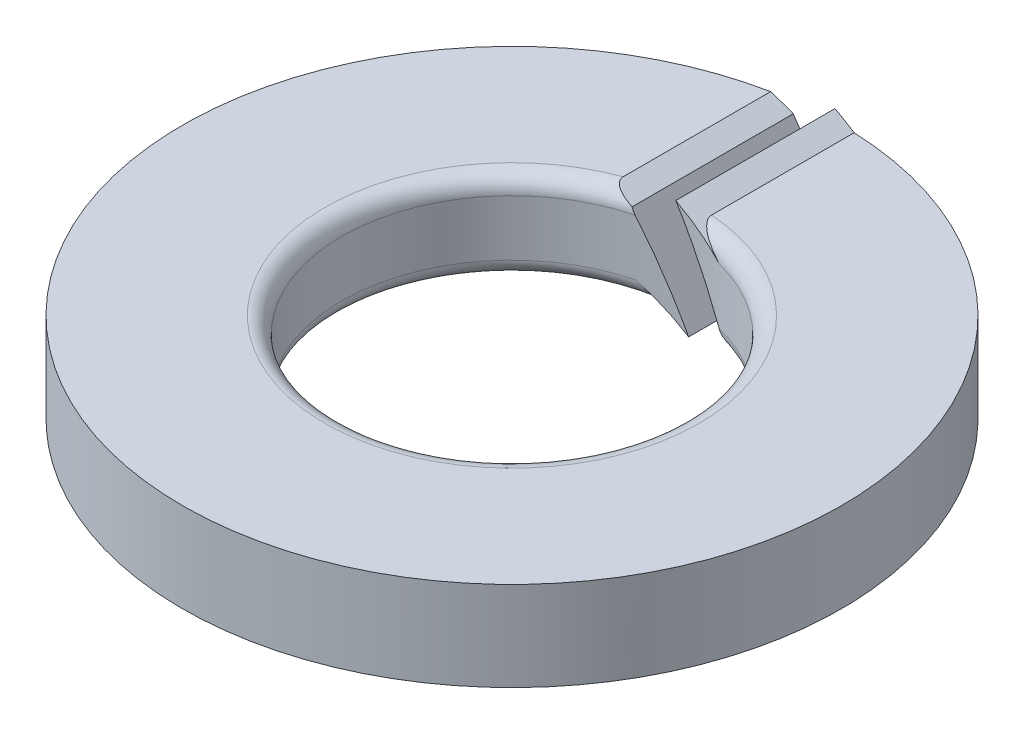
ISO-10303-21;
HEADER;
FILE_DESCRIPTION(('STEP AP214'),'2;1');
FILE_NAME('part.step','',(''),(''),'','','');
FILE_SCHEMA(('AUTOMOTIVE_DESIGN { 1 0 10303 214 1 1 1 1 }'));
ENDSEC;
DATA;
#1=APPLICATION_CONTEXT('core data for automotive mechanical design processes');
#2=APPLICATION_PROTOCOL_DEFINITION('international standard','automotive_design',2000,#1);
#3=PRODUCT_CONTEXT('',#1,'mechanical');
#4=PRODUCT('Part','Part','',(#3));
#5=PRODUCT_RELATED_PRODUCT_CATEGORY('part','',(#4));
#6=PRODUCT_DEFINITION_FORMATION('','',#4);
#7=PRODUCT_DEFINITION_CONTEXT('part definition',#1,'design');
#8=PRODUCT_DEFINITION('design','',#6,#7);
#9=PRODUCT_DEFINITION_SHAPE('','',#8);
#10=(LENGTH_UNIT() NAMED_UNIT(*) SI_UNIT(.MILLI.,.METRE.));
#11=(NAMED_UNIT(*) PLANE_ANGLE_UNIT() SI_UNIT($,.RADIAN.));
#12=(NAMED_UNIT(*) SI_UNIT($,.STERADIAN.) SOLID_ANGLE_UNIT());
#13=UNCERTAINTY_MEASURE_WITH_UNIT(LENGTH_MEASURE(1.E-05),#10,'distance_accuracy_value','');
#14=(GEOMETRIC_REPRESENTATION_CONTEXT(3) GLOBAL_UNCERTAINTY_ASSIGNED_CONTEXT((#13)) GLOBAL_UNIT_ASSIGNED_CONTEXT((#10,
#11,#12)) REPRESENTATION_CONTEXT('',''));
#15=CARTESIAN_POINT('',(0.,0.,0.));
#16=DIRECTION('',(0.,0.,1.));
#17=DIRECTION('',(1.,0.,0.));
#18=AXIS2_PLACEMENT_3D('',#15,#16,#17);
#19=CARTESIAN_POINT('',(0.,0.,0.));
#20=DIRECTION('',(0.,-1.,0.));
#21=DIRECTION('',(0.,0.,-1.));
#22=AXIS2_PLACEMENT_3D('',#19,#20,#21);
#23=CYLINDRICAL_SURFACE('',#22,5.9);
#24=CARTESIAN_POINT('',(0.,0.933333333333333,0.));
#25=DIRECTION('',(-0.499999999999998,-0.86602540378444,0.));
#26=DIRECTION('',(0.86602540378444,-0.499999999999998,0.));
#27=AXIS2_PLACEMENT_3D('',#24,#25,#26);
#28=ELLIPSE('',#27,6.81273317643758,5.9);
#29=CARTESIAN_POINT('',(0.230940107675852,0.799999999999999,-5.8954784934445));
#30=VERTEX_POINT('',#29);
#31=CARTESIAN_POINT('',(-0.115470053837926,0.999999999999999,-5.8988699482754));
#32=VERTEX_POINT('',#31);
#33=EDGE_CURVE('E124',#30,#32,#28,.F.);
#34=ORIENTED_EDGE('',*,*,#33,.F.);
#35=CARTESIAN_POINT('',(0.,0.799999999999999,0.));
#36=DIRECTION('',(0.,1.,0.));
#37=DIRECTION('',(-1.,0.,0.));
#38=AXIS2_PLACEMENT_3D('',#35,#36,#37);
#39=CIRCLE('',#38,5.9);
#40=CARTESIAN_POINT('',(-1.15470053837926,0.799999999999999,-5.78590240728848));
#41=VERTEX_POINT('',#40);
#42=EDGE_CURVE('E114',#30,#41,#39,.F.);
#43=ORIENTED_EDGE('',*,*,#42,.T.);
#44=CARTESIAN_POINT('',(0.,0.133333333333335,0.));
#45=DIRECTION('',(-0.499999999999997,-0.86602540378444,0.));
#46=DIRECTION('',(0.86602540378444,-0.499999999999997,0.));
#47=AXIS2_PLACEMENT_3D('',#44,#45,#46);
#48=ELLIPSE('',#47,6.81273317643757,5.9);
#49=CARTESIAN_POINT('',(-0.808290376865477,0.599999999999999,-5.84437051072797));
#50=VERTEX_POINT('',#49);
#51=EDGE_CURVE('E131',#50,#41,#48,.F.);
#52=ORIENTED_EDGE('',*,*,#51,.F.);
#53=CARTESIAN_POINT('',(0.,-0.799999999999997,0.));
#54=DIRECTION('',(-0.866025403784438,-0.500000000000001,0.));
#55=DIRECTION('',(0.500000000000001,-0.866025403784438,0.));
#56=AXIS2_PLACEMENT_3D('',#53,#54,#55);
#57=ELLIPSE('',#56,11.8,5.9);
#58=CARTESIAN_POINT('',(0.115470053837927,-1.,-5.8988699482754));
#59=VERTEX_POINT('',#58);
#60=EDGE_CURVE('E246',#59,#50,#57,.F.);
#61=ORIENTED_EDGE('',*,*,#60,.F.);
#62=CARTESIAN_POINT('',(0.,-0.933333333333333,0.));
#63=DIRECTION('',(0.499999999999997,0.866025403784441,0.));
#64=DIRECTION('',(0.866025403784441,-0.499999999999997,0.));
#65=AXIS2_PLACEMENT_3D('',#62,#63,#64);
#66=ELLIPSE('',#65,6.81273317643757,5.9);
#67=CARTESIAN_POINT('',(-0.23094010767585,-0.800000000000001,-5.8954784934445));
#68=VERTEX_POINT('',#67);
#69=EDGE_CURVE('E248',#68,#59,#66,.F.);
#70=ORIENTED_EDGE('',*,*,#69,.F.);
#71=CARTESIAN_POINT('',(0.,-0.800000000000001,0.));
#72=DIRECTION('',(0.,-1.,0.));
#73=DIRECTION('',(1.,0.,0.));
#74=AXIS2_PLACEMENT_3D('',#71,#72,#73);
#75=CIRCLE('',#74,5.9);
#76=CARTESIAN_POINT('',(1.15470053837926,-0.8,-5.78590240728848));
#77=VERTEX_POINT('',#76);
#78=EDGE_CURVE('E123',#68,#77,#75,.F.);
#79=ORIENTED_EDGE('',*,*,#78,.T.);
#80=CARTESIAN_POINT('',(0.,-0.133333333333333,0.));
#81=DIRECTION('',(0.499999999999999,0.866025403784439,0.));
#82=DIRECTION('',(0.866025403784439,-0.499999999999999,0.));
#83=AXIS2_PLACEMENT_3D('',#80,#81,#82);
#84=ELLIPSE('',#83,6.81273317643758,5.9);
#85=CARTESIAN_POINT('',(0.808290376865478,-0.6,-5.84437051072797));
#86=VERTEX_POINT('',#85);
#87=EDGE_CURVE('E138',#86,#77,#84,.F.);
#88=ORIENTED_EDGE('',*,*,#87,.F.);
#89=CARTESIAN_POINT('',(0.,0.799999999999999,0.));
#90=DIRECTION('',(0.866025403784438,0.500000000000001,0.));
#91=DIRECTION('',(0.500000000000001,-0.866025403784438,0.));
#92=AXIS2_PLACEMENT_3D('',#89,#90,#91);
#93=ELLIPSE('',#92,11.8,5.9);
#94=EDGE_CURVE('E136',#32,#86,#93,.F.);
#95=ORIENTED_EDGE('',*,*,#94,.F.);
#96=EDGE_LOOP('',(#34,#43,#52,#61,#70,#79,#88,#95));
#97=FACE_BOUND('',#96,.T.);
#98=ADVANCED_FACE('F33',(#97),#23,.T.);
#99=CARTESIAN_POINT('',(0.,0.,0.));
#100=DIRECTION('',(0.,-1.,0.));
#101=DIRECTION('',(0.,0.,-1.));
#102=AXIS2_PLACEMENT_3D('',#99,#100,#101);
#103=CYLINDRICAL_SURFACE('',#102,3.05);
#104=CARTESIAN_POINT('',(0.,0.799999999999999,0.));
#105=DIRECTION('',(0.866025403784438,0.500000000000001,0.));
#106=DIRECTION('',(0.500000000000001,-0.866025403784438,0.));
#107=AXIS2_PLACEMENT_3D('',#104,#105,#106);
#108=ELLIPSE('',#107,6.09999999999998,3.05);
#109=CARTESIAN_POINT('',(0.750555349946516,-0.500000000000001,-2.9562081568568));
#110=VERTEX_POINT('',#109);
#111=CARTESIAN_POINT('',(-0.115470053837926,0.999999999999999,-3.04781342386089));
#112=VERTEX_POINT('',#111);
#113=EDGE_CURVE('E147',#110,#112,#108,.T.);
#114=ORIENTED_EDGE('',*,*,#113,.F.);
#115=CARTESIAN_POINT('',(0.,-0.500000000000001,0.));
#116=DIRECTION('',(0.,-1.,0.));
#117=DIRECTION('',(1.,0.,0.));
#118=AXIS2_PLACEMENT_3D('',#115,#116,#117);
#119=CIRCLE('',#118,3.05);
#120=CARTESIAN_POINT('',(-0.750555349946519,-0.500000000000001,-2.9562081568568));
#121=VERTEX_POINT('',#120);
#122=EDGE_CURVE('E154',#110,#121,#119,.T.);
#123=ORIENTED_EDGE('',*,*,#122,.T.);
#124=CARTESIAN_POINT('',(0.,-0.933333333333333,0.));
#125=DIRECTION('',(0.499999999999997,0.866025403784441,0.));
#126=DIRECTION('',(0.866025403784441,-0.499999999999997,0.));
#127=AXIS2_PLACEMENT_3D('',#124,#125,#126);
#128=ELLIPSE('',#127,3.52183664205671,3.05);
#129=CARTESIAN_POINT('',(0.115470053837927,-1.,-3.04781342386089));
#130=VERTEX_POINT('',#129);
#131=EDGE_CURVE('E145',#130,#121,#128,.T.);
#132=ORIENTED_EDGE('',*,*,#131,.F.);
#133=CARTESIAN_POINT('',(0.,-0.799999999999997,0.));
#134=DIRECTION('',(-0.866025403784438,-0.500000000000001,0.));
#135=DIRECTION('',(0.500000000000001,-0.866025403784438,0.));
#136=AXIS2_PLACEMENT_3D('',#133,#134,#135);
#137=ELLIPSE('',#136,6.09999999999998,3.05);
#138=CARTESIAN_POINT('',(-0.750555349946514,0.499999999999999,-2.9562081568568));
#139=VERTEX_POINT('',#138);
#140=EDGE_CURVE('E143',#139,#130,#137,.T.);
#141=ORIENTED_EDGE('',*,*,#140,.F.);
#142=CARTESIAN_POINT('',(0.,0.499999999999999,0.));
#143=DIRECTION('',(0.,1.,0.));
#144=DIRECTION('',(-1.,0.,0.));
#145=AXIS2_PLACEMENT_3D('',#142,#143,#144);
#146=CIRCLE('',#145,3.05);
#147=CARTESIAN_POINT('',(0.750555349946516,0.5,-2.9562081568568));
#148=VERTEX_POINT('',#147);
#149=EDGE_CURVE('E151',#139,#148,#146,.T.);
#150=ORIENTED_EDGE('',*,*,#149,.T.);
#151=CARTESIAN_POINT('',(0.,0.933333333333333,0.));
#152=DIRECTION('',(-0.499999999999998,-0.86602540378444,0.));
#153=DIRECTION('',(0.86602540378444,-0.499999999999998,0.));
#154=AXIS2_PLACEMENT_3D('',#151,#152,#153);
#155=ELLIPSE('',#154,3.52183664205671,3.05);
#156=EDGE_CURVE('E149',#112,#148,#155,.T.);
#157=ORIENTED_EDGE('',*,*,#156,.F.);
#158=EDGE_LOOP('',(#114,#123,#132,#141,#150,#157));
#159=FACE_BOUND('',#158,.T.);
#160=ADVANCED_FACE('F210',(#159),#103,.F.);
#161=CARTESIAN_POINT('',(5.9,-0.8,5.9));
#162=DIRECTION('',(0.,-1.,0.));
#163=DIRECTION('',(1.,0.,0.));
#164=AXIS2_PLACEMENT_3D('',#161,#162,#163);
#165=PLANE('',#164);
#166=DIRECTION('',(0.,0.,1.));
#167=VECTOR('',#166,1.);
#168=CARTESIAN_POINT('',(-0.23094010767585,-0.800000000000001,-5.9));
#169=LINE('',#168,#167);
#170=CARTESIAN_POINT('',(-0.23094010767585,-0.800000000000001,-3.34203032102742));
#171=VERTEX_POINT('',#170);
#172=EDGE_CURVE('E229',#68,#171,#169,.T.);
#173=ORIENTED_EDGE('',*,*,#172,.T.);
#174=CARTESIAN_POINT('',(0.,-0.800000000000001,0.));
#175=DIRECTION('',(0.,-1.,0.));
#176=DIRECTION('',(1.,0.,0.));
#177=AXIS2_PLACEMENT_3D('',#174,#175,#176);
#178=CIRCLE('',#177,3.35);
#179=CARTESIAN_POINT('',(1.15470053837926,-0.8,-3.14470454362038));
#180=VERTEX_POINT('',#179);
#181=EDGE_CURVE('E157',#171,#180,#178,.F.);
#182=ORIENTED_EDGE('',*,*,#181,.T.);
#183=DIRECTION('',(0.,0.,1.));
#184=VECTOR('',#183,1.);
#185=CARTESIAN_POINT('',(1.15470053837926,-0.8,-5.9));
#186=LINE('',#185,#184);
#187=EDGE_CURVE('E234',#77,#180,#186,.T.);
#188=ORIENTED_EDGE('',*,*,#187,.F.);
#189=ORIENTED_EDGE('',*,*,#78,.F.);
#190=EDGE_LOOP('',(#173,#182,#188,#189));
#191=FACE_BOUND('',#190,.T.);
#192=ADVANCED_FACE('F207',(#191),#165,.T.);
#193=CARTESIAN_POINT('',(5.9,0.8,5.9));
#194=DIRECTION('',(0.,1.,0.));
#195=DIRECTION('',(-1.,0.,0.));
#196=AXIS2_PLACEMENT_3D('',#193,#194,#195);
#197=PLANE('',#196);
#198=DIRECTION('',(0.,0.,1.));
#199=VECTOR('',#198,1.);
#200=CARTESIAN_POINT('',(0.230940107675852,0.799999999999999,-5.9));
#201=LINE('',#200,#199);
#202=CARTESIAN_POINT('',(0.230940107675852,0.799999999999999,-3.34203032102742));
#203=VERTEX_POINT('',#202);
#204=EDGE_CURVE('E117',#30,#203,#201,.T.);
#205=ORIENTED_EDGE('',*,*,#204,.T.);
#206=CARTESIAN_POINT('',(0.,0.799999999999999,0.));
#207=DIRECTION('',(0.,1.,0.));
#208=DIRECTION('',(-1.,0.,0.));
#209=AXIS2_PLACEMENT_3D('',#206,#207,#208);
#210=CIRCLE('',#209,3.35);
#211=CARTESIAN_POINT('',(-1.15470053837926,0.799999999999999,-3.14470454362038));
#212=VERTEX_POINT('',#211);
#213=EDGE_CURVE('E61',#203,#212,#210,.F.);
#214=ORIENTED_EDGE('',*,*,#213,.T.);
#215=DIRECTION('',(0.,0.,1.));
#216=VECTOR('',#215,1.);
#217=CARTESIAN_POINT('',(-1.15470053837926,0.799999999999999,-5.9));
#218=LINE('',#217,#216);
#219=EDGE_CURVE('E118',#41,#212,#218,.T.);
#220=ORIENTED_EDGE('',*,*,#219,.F.);
#221=ORIENTED_EDGE('',*,*,#42,.F.);
#222=EDGE_LOOP('',(#205,#214,#220,#221));
#223=FACE_BOUND('',#222,.T.);
#224=ADVANCED_FACE('F116',(#223),#197,.T.);
#225=CARTESIAN_POINT('',(0.808290376865478,-0.6,-5.9));
#226=DIRECTION('',(0.499999999999999,0.866025403784439,0.));
#227=DIRECTION('',(-0.866025403784439,0.499999999999999,0.));
#228=AXIS2_PLACEMENT_3D('',#225,#226,#227);
#229=PLANE('',#228);
#230=ORIENTED_EDGE('',*,*,#187,.T.);
#231=CARTESIAN_POINT('',(1.15470053837926,-0.8,-3.14470454362038));
#232=CARTESIAN_POINT('',(1.15472724232958,-0.800015417532906,-3.13546044768566));
#233=CARTESIAN_POINT('',(1.15405080912969,-0.799624878642861,-3.12618916848948));
#234=CARTESIAN_POINT('',(1.15124977527525,-0.798007700992993,-3.10798319921414));
#235=CARTESIAN_POINT('',(1.14913068868081,-0.796784245777258,-3.09904736374361));
#236=CARTESIAN_POINT('',(1.14338736034663,-0.793468333617474,-3.08177948638672));
#237=CARTESIAN_POINT('',(1.13975477897806,-0.791371061786476,-3.07345109514843));
#238=CARTESIAN_POINT('',(1.13118155395271,-0.786421308010268,-3.05776800553277));
#239=CARTESIAN_POINT('',(1.12624169042694,-0.783569276473904,-3.05041273035423));
#240=CARTESIAN_POINT('',(1.11458972132114,-0.77684200897408,-3.03584116203186));
#241=CARTESIAN_POINT('',(1.10772638727571,-0.772879461215413,-3.02878812854533));
#242=CARTESIAN_POINT('',(1.09311287349914,-0.764442345102705,-3.01603488125443));
#243=CARTESIAN_POINT('',(1.0853605828171,-0.759966557990594,-3.01033799066908));
#244=CARTESIAN_POINT('',(1.06408325926674,-0.747682089511159,-2.99680553816842));
#245=CARTESIAN_POINT('',(1.05008064432668,-0.739597676006154,-2.98998599004732));
#246=CARTESIAN_POINT('',(1.02133000699907,-0.722998487805688,-2.97868603875841));
#247=CARTESIAN_POINT('',(1.00657740979672,-0.714481071839665,-2.9742225351519));
#248=CARTESIAN_POINT('',(0.976395708959408,-0.697055658736642,-2.96696746939307));
#249=CARTESIAN_POINT('',(0.960958906096382,-0.688143216448246,-2.96422027409468));
#250=CARTESIAN_POINT('',(0.929929680272982,-0.670228484566361,-2.96011963502286));
#251=CARTESIAN_POINT('',(0.914337033317726,-0.661226065649365,-2.95876862403869));
#252=CARTESIAN_POINT('',(0.883631158582293,-0.64349802060516,-2.95718792714175));
#253=CARTESIAN_POINT('',(0.868519146027506,-0.634773096088656,-2.95692260454203));
#254=CARTESIAN_POINT('',(0.838360658409041,-0.617361085143784,-2.95724074599216));
#255=CARTESIAN_POINT('',(0.823314161447282,-0.608673986072551,-2.95782084288035));
#256=CARTESIAN_POINT('',(0.808290376865478,-0.6,-2.95873630002518));
#257=B_SPLINE_CURVE_WITH_KNOTS('',3,(#231,#232,#233,#234,#235,#236,#237,#238,#239,#240,#241,
#242,#243,#244,#245,#246,#247,#248,#249,#250,#251,#252,#253,#254,#255,#256),.UNSPECIFIED.,.F.,
.F.,(4,2,2,2,2,2,2,2,2,2,2,2,4),(0.,0.0277371728501738,0.0553689204704561,0.0831549808886673,
0.110924497000333,0.142577180145474,0.174306647406277,0.22665553217314,0.279374973446515,
0.33340624079824,0.387531497305223,0.439865154937414,0.491990945320323),.UNSPECIFIED.);
#258=CARTESIAN_POINT('',(0.808290376865478,-0.6,-2.95873630002518));
#259=VERTEX_POINT('',#258);
#260=EDGE_CURVE('E159',#180,#259,#257,.T.);
#261=ORIENTED_EDGE('',*,*,#260,.T.);
#262=DIRECTION('',(0.,0.,1.));
#263=VECTOR('',#262,1.);
#264=CARTESIAN_POINT('',(0.808290376865478,-0.6,-5.9));
#265=LINE('',#264,#263);
#266=EDGE_CURVE('E237',#86,#259,#265,.T.);
#267=ORIENTED_EDGE('',*,*,#266,.F.);
#268=ORIENTED_EDGE('',*,*,#87,.T.);
#269=EDGE_LOOP('',(#230,#261,#267,#268));
#270=FACE_BOUND('',#269,.T.);
#271=ADVANCED_FACE('F174',(#270),#229,.F.);
#272=CARTESIAN_POINT('',(0.808290376865478,-0.6,-5.9));
#273=DIRECTION('',(0.866025403784438,0.500000000000001,0.));
#274=DIRECTION('',(-0.500000000000001,0.866025403784438,0.));
#275=AXIS2_PLACEMENT_3D('',#272,#273,#274);
#276=PLANE('',#275);
#277=ORIENTED_EDGE('',*,*,#266,.T.);
#278=CARTESIAN_POINT('',(0.808290376865478,-0.6,-2.95873630002518));
#279=CARTESIAN_POINT('',(0.803521321668378,-0.591739754094521,-2.95701186657913));
#280=CARTESIAN_POINT('',(0.798717755783908,-0.583419733925116,-2.95568780189027));
#281=CARTESIAN_POINT('',(0.789100692298362,-0.566762491348535,-2.9538140558413));
#282=CARTESIAN_POINT('',(0.784287411071207,-0.558425643711985,-2.95325996033055));
#283=CARTESIAN_POINT('',(0.774655035105818,-0.541741879142326,-2.95288072339885));
#284=CARTESIAN_POINT('',(0.769835941251392,-0.533394963740017,-2.95305548242653));
#285=CARTESIAN_POINT('',(0.76018879235283,-0.516685611699525,-2.95410727970608));
#286=CARTESIAN_POINT('',(0.755360846938961,-0.508323364946535,-2.95498837769461));
#287=CARTESIAN_POINT('',(0.750555349946516,-0.500000000000001,-2.9562081568568));
#288=B_SPLINE_CURVE_WITH_KNOTS('',3,(#278,#279,#280,#281,#282,#283,#284,#285,#286,#287),
.UNSPECIFIED.,.F.,.F.,(4,2,2,2,4),(0.,0.0290649745563326,0.0579626255247683,0.0868563296059689,
0.115917303418203),.UNSPECIFIED.);
#289=EDGE_CURVE('E165',#259,#110,#288,.T.);
#290=ORIENTED_EDGE('',*,*,#289,.T.);
#291=ORIENTED_EDGE('',*,*,#113,.T.);
#292=DIRECTION('',(0.,0.,1.));
#293=VECTOR('',#292,1.);
#294=CARTESIAN_POINT('',(-0.115470053837926,0.999999999999999,-5.9));
#295=LINE('',#294,#293);
#296=EDGE_CURVE('E132',#32,#112,#295,.T.);
#297=ORIENTED_EDGE('',*,*,#296,.F.);
#298=ORIENTED_EDGE('',*,*,#94,.T.);
#299=EDGE_LOOP('',(#277,#290,#291,#297,#298));
#300=FACE_BOUND('',#299,.T.);
#301=ADVANCED_FACE('F178',(#300),#276,.F.);
#302=CARTESIAN_POINT('',(-0.115470053837926,0.999999999999999,-5.9));
#303=DIRECTION('',(-0.499999999999998,-0.86602540378444,0.));
#304=DIRECTION('',(0.86602540378444,-0.499999999999998,0.));
#305=AXIS2_PLACEMENT_3D('',#302,#303,#304);
#306=PLANE('',#305);
#307=ORIENTED_EDGE('',*,*,#33,.T.);
#308=ORIENTED_EDGE('',*,*,#296,.T.);
#309=ORIENTED_EDGE('',*,*,#156,.T.);
#310=CARTESIAN_POINT('',(0.750555349946517,0.499999999999999,-2.9562081568568));
#311=CARTESIAN_POINT('',(0.725088390240705,0.514703356041591,-2.9626986312174));
#312=CARTESIAN_POINT('',(0.699747762029129,0.529333774560979,-2.9698740448105));
#313=CARTESIAN_POINT('',(0.649350384156601,0.558430714242134,-2.9856871291144));
#314=CARTESIAN_POINT('',(0.624294403474859,0.572896791433548,-2.99432806063932));
#315=CARTESIAN_POINT('',(0.574499200549006,0.601646065247141,-3.01317912084795));
#316=CARTESIAN_POINT('',(0.549761959374783,0.615928118098087,-3.02339626810047));
#317=CARTESIAN_POINT('',(0.500913527173893,0.644130773578762,-3.04561607171586));
#318=CARTESIAN_POINT('',(0.476801724916092,0.658051729102951,-3.05761690126072));
#319=CARTESIAN_POINT('',(0.436445199908578,0.681351579679597,-3.08001369310359));
#320=CARTESIAN_POINT('',(0.419967724083129,0.690864854782985,-3.08984760662272));
#321=CARTESIAN_POINT('',(0.387659463764345,0.709518037575083,-3.11090740545599));
#322=CARTESIAN_POINT('',(0.371829342441877,0.718657562381914,-3.12213467291217));
#323=CARTESIAN_POINT('',(0.341056198944345,0.736424445064026,-3.14643473119891));
#324=CARTESIAN_POINT('',(0.326121902409167,0.745046765188768,-3.15952245725661));
#325=CARTESIAN_POINT('',(0.297959573092921,0.76130629360051,-3.1879920285391));
#326=CARTESIAN_POINT('',(0.284727351245715,0.768945920445971,-3.20336803244634));
#327=CARTESIAN_POINT('',(0.266951180456217,0.779208997436448,-3.22889741547982));
#328=CARTESIAN_POINT('',(0.261290326812129,0.782477292811706,-3.23800373080083));
#329=CARTESIAN_POINT('',(0.251120927595302,0.788348598187037,-3.25699645389906));
#330=CARTESIAN_POINT('',(0.246607128312001,0.790954641418319,-3.26687902328065));
#331=CARTESIAN_POINT('',(0.23913322264627,0.795269702866327,-3.28731403690176));
#332=CARTESIAN_POINT('',(0.236158348782162,0.796987247092575,-3.29785898209644));
#333=CARTESIAN_POINT('',(0.232031693115451,0.799369772852603,-3.31958085455425));
#334=CARTESIAN_POINT('',(0.230910085993167,0.800017333026579,-3.33076523125679));
#335=CARTESIAN_POINT('',(0.230940107675851,0.799999999999999,-3.34203032102742));
#336=B_SPLINE_CURVE_WITH_KNOTS('',3,(#310,#311,#312,#313,#314,#315,#316,#317,#318,#319,#320,
#321,#322,#323,#324,#325,#326,#327,#328,#329,#330,#331,#332,#333,#334,#335),.UNSPECIFIED.,.F.,
.F.,(4,2,2,2,2,2,2,2,2,2,2,2,4),(0.,0.0903429040447332,0.180889525745232,0.27185163500438,
0.362721216271426,0.426932291458256,0.491207577914841,0.55603151414847,0.620692725148271,
0.654240148271217,0.687631030370202,0.720695256154746,0.754292708175523),.UNSPECIFIED.);
#337=EDGE_CURVE('E11',#148,#203,#336,.T.);
#338=ORIENTED_EDGE('',*,*,#337,.T.);
#339=ORIENTED_EDGE('',*,*,#204,.F.);
#340=EDGE_LOOP('',(#307,#308,#309,#338,#339));
#341=FACE_BOUND('',#340,.T.);
#342=ADVANCED_FACE('F127',(#341),#306,.F.);
#343=CARTESIAN_POINT('',(0.115470053837927,-1.,-5.9));
#344=DIRECTION('',(0.499999999999997,0.866025403784441,0.));
#345=DIRECTION('',(-0.866025403784441,0.499999999999997,0.));
#346=AXIS2_PLACEMENT_3D('',#343,#344,#345);
#347=PLANE('',#346);
#348=ORIENTED_EDGE('',*,*,#69,.T.);
#349=DIRECTION('',(0.,0.,1.));
#350=VECTOR('',#349,1.);
#351=CARTESIAN_POINT('',(0.115470053837927,-1.,-5.9));
#352=LINE('',#351,#350);
#353=EDGE_CURVE('E235',#59,#130,#352,.T.);
#354=ORIENTED_EDGE('',*,*,#353,.T.);
#355=ORIENTED_EDGE('',*,*,#131,.T.);
#356=CARTESIAN_POINT('',(-0.750555349946519,-0.500000000000001,-2.9562081568568));
#357=CARTESIAN_POINT('',(-0.725088390240707,-0.514703356041592,-2.9626986312174));
#358=CARTESIAN_POINT('',(-0.699747762029131,-0.52933377456098,-2.9698740448105));
#359=CARTESIAN_POINT('',(-0.649350384156603,-0.558430714242135,-2.9856871291144));
#360=CARTESIAN_POINT('',(-0.624294403474861,-0.572896791433549,-2.99432806063932));
#361=CARTESIAN_POINT('',(-0.574499200549009,-0.601646065247141,-3.01317912084795));
#362=CARTESIAN_POINT('',(-0.549761959374786,-0.615928118098087,-3.02339626810047));
#363=CARTESIAN_POINT('',(-0.500913527173897,-0.644130773578761,-3.04561607171585));
#364=CARTESIAN_POINT('',(-0.476801724916096,-0.65805172910295,-3.05761690126071));
#365=CARTESIAN_POINT('',(-0.436445199908581,-0.681351579679596,-3.08001369310358));
#366=CARTESIAN_POINT('',(-0.419967724083133,-0.690864854782984,-3.08984760662272));
#367=CARTESIAN_POINT('',(-0.387659463764349,-0.709518037575082,-3.11090740545599));
#368=CARTESIAN_POINT('',(-0.37182934244188,-0.718657562381914,-3.12213467291217));
#369=CARTESIAN_POINT('',(-0.341056198944347,-0.736424445064025,-3.14643473119891));
#370=CARTESIAN_POINT('',(-0.326121902409169,-0.745046765188768,-3.15952245725661));
#371=CARTESIAN_POINT('',(-0.297959573092923,-0.76130629360051,-3.1879920285391));
#372=CARTESIAN_POINT('',(-0.284727351245717,-0.768945920445971,-3.20336803244634));
#373=CARTESIAN_POINT('',(-0.266951180456219,-0.779208997436448,-3.22889741547982));
#374=CARTESIAN_POINT('',(-0.26129032681213,-0.782477292811706,-3.23800373080083));
#375=CARTESIAN_POINT('',(-0.251120927595303,-0.788348598187038,-3.25699645389906));
#376=CARTESIAN_POINT('',(-0.246607128312002,-0.79095464141832,-3.26687902328065));
#377=CARTESIAN_POINT('',(-0.23913322264627,-0.795269702866328,-3.28731403690176));
#378=CARTESIAN_POINT('',(-0.236158348782162,-0.796987247092576,-3.29785898209644));
#379=CARTESIAN_POINT('',(-0.23203169311545,-0.799369772852604,-3.31958085455425));
#380=CARTESIAN_POINT('',(-0.230910085993166,-0.80001733302658,-3.33076523125679));
#381=CARTESIAN_POINT('',(-0.230940107675851,-0.800000000000001,-3.34203032102742));
#382=B_SPLINE_CURVE_WITH_KNOTS('',3,(#356,#357,#358,#359,#360,#361,#362,#363,#364,#365,#366,
#367,#368,#369,#370,#371,#372,#373,#374,#375,#376,#377,#378,#379,#380,#381),.UNSPECIFIED.,.F.,
.F.,(4,2,2,2,2,2,2,2,2,2,2,2,4),(0.,0.0903429040447327,0.18088952574523,0.271851635004378,
0.362721216271422,0.426932291458253,0.491207577914839,0.556031514148467,0.620692725148269,
0.654240148271216,0.687631030370201,0.720695256154746,0.754292708175525),.UNSPECIFIED.);
#383=EDGE_CURVE('E46',#121,#171,#382,.T.);
#384=ORIENTED_EDGE('',*,*,#383,.T.);
#385=ORIENTED_EDGE('',*,*,#172,.F.);
#386=EDGE_LOOP('',(#348,#354,#355,#384,#385));
#387=FACE_BOUND('',#386,.T.);
#388=ADVANCED_FACE('F181',(#387),#347,.F.);
#389=CARTESIAN_POINT('',(0.115470053837927,-1.,-5.9));
#390=DIRECTION('',(-0.866025403784438,-0.500000000000001,0.));
#391=DIRECTION('',(0.500000000000001,-0.866025403784438,0.));
#392=AXIS2_PLACEMENT_3D('',#389,#390,#391);
#393=PLANE('',#392);
#394=DIRECTION('',(0.,0.,1.));
#395=VECTOR('',#394,1.);
#396=CARTESIAN_POINT('',(-0.808290376865477,0.599999999999999,-5.9));
#397=LINE('',#396,#395);
#398=CARTESIAN_POINT('',(-0.808290376865477,0.599999999999999,-2.95873630002519));
#399=VERTEX_POINT('',#398);
#400=EDGE_CURVE('E239',#50,#399,#397,.T.);
#401=ORIENTED_EDGE('',*,*,#400,.T.);
#402=CARTESIAN_POINT('',(-0.808290376865477,0.599999999999999,-2.95873630002519));
#403=CARTESIAN_POINT('',(-0.803521321668376,0.59173975409452,-2.95701186657913));
#404=CARTESIAN_POINT('',(-0.798717755783907,0.583419733925115,-2.95568780189027));
#405=CARTESIAN_POINT('',(-0.789100692298361,0.566762491348533,-2.9538140558413));
#406=CARTESIAN_POINT('',(-0.784287411071206,0.558425643711984,-2.95325996033055));
#407=CARTESIAN_POINT('',(-0.774655035105817,0.541741879142325,-2.95288072339885));
#408=CARTESIAN_POINT('',(-0.769835941251391,0.533394963740016,-2.95305548242653));
#409=CARTESIAN_POINT('',(-0.760188792352829,0.516685611699524,-2.95410727970608));
#410=CARTESIAN_POINT('',(-0.75536084693896,0.508323364946534,-2.95498837769461));
#411=CARTESIAN_POINT('',(-0.750555349946514,0.499999999999999,-2.9562081568568));
#412=B_SPLINE_CURVE_WITH_KNOTS('',3,(#402,#403,#404,#405,#406,#407,#408,#409,#410,#411),
.UNSPECIFIED.,.F.,.F.,(4,2,2,2,4),(0.,0.0290649745563328,0.0579626255247686,0.0868563296059691,
0.115917303418203),.UNSPECIFIED.);
#413=EDGE_CURVE('E193',#399,#139,#412,.T.);
#414=ORIENTED_EDGE('',*,*,#413,.T.);
#415=ORIENTED_EDGE('',*,*,#140,.T.);
#416=ORIENTED_EDGE('',*,*,#353,.F.);
#417=ORIENTED_EDGE('',*,*,#60,.T.);
#418=EDGE_LOOP('',(#401,#414,#415,#416,#417));
#419=FACE_BOUND('',#418,.T.);
#420=ADVANCED_FACE('F185',(#419),#393,.F.);
#421=CARTESIAN_POINT('',(-1.15470053837926,0.799999999999999,-5.9));
#422=DIRECTION('',(-0.499999999999997,-0.86602540378444,0.));
#423=DIRECTION('',(0.86602540378444,-0.499999999999997,0.));
#424=AXIS2_PLACEMENT_3D('',#421,#422,#423);
#425=PLANE('',#424);
#426=ORIENTED_EDGE('',*,*,#219,.T.);
#427=CARTESIAN_POINT('',(-1.15470053837926,0.799999999999999,-3.14470454362038));
#428=CARTESIAN_POINT('',(-1.15472724232958,0.800015417532905,-3.13546044768566));
#429=CARTESIAN_POINT('',(-1.15405080912969,0.79962487864286,-3.12618916848948));
#430=CARTESIAN_POINT('',(-1.15124977527525,0.798007700992992,-3.10798319921414));
#431=CARTESIAN_POINT('',(-1.14913068868081,0.796784245777257,-3.09904736374361));
#432=CARTESIAN_POINT('',(-1.14338736034663,0.793468333617473,-3.08177948638672));
#433=CARTESIAN_POINT('',(-1.13975477897806,0.791371061786475,-3.07345109514843));
#434=CARTESIAN_POINT('',(-1.13118155395271,0.786421308010267,-3.05776800553277));
#435=CARTESIAN_POINT('',(-1.12624169042694,0.783569276473903,-3.05041273035423));
#436=CARTESIAN_POINT('',(-1.11458972132114,0.776842008974079,-3.03584116203186));
#437=CARTESIAN_POINT('',(-1.10772638727571,0.772879461215413,-3.02878812854533));
#438=CARTESIAN_POINT('',(-1.09311287349914,0.764442345102705,-3.01603488125443));
#439=CARTESIAN_POINT('',(-1.0853605828171,0.759966557990594,-3.01033799066909));
#440=CARTESIAN_POINT('',(-1.06408325926674,0.747682089511159,-2.99680553816842));
#441=CARTESIAN_POINT('',(-1.05008064432668,0.739597676006154,-2.98998599004732));
#442=CARTESIAN_POINT('',(-1.02133000699907,0.722998487805689,-2.97868603875841));
#443=CARTESIAN_POINT('',(-1.00657740979672,0.714481071839666,-2.9742225351519));
#444=CARTESIAN_POINT('',(-0.976395708959411,0.697055658736642,-2.96696746939307));
#445=CARTESIAN_POINT('',(-0.960958906096384,0.688143216448247,-2.96422027409468));
#446=CARTESIAN_POINT('',(-0.929929680272984,0.670228484566361,-2.96011963502286));
#447=CARTESIAN_POINT('',(-0.914337033317728,0.661226065649365,-2.95876862403869));
#448=CARTESIAN_POINT('',(-0.883631158582294,0.64349802060516,-2.95718792714175));
#449=CARTESIAN_POINT('',(-0.868519146027506,0.634773096088656,-2.95692260454203));
#450=CARTESIAN_POINT('',(-0.838360658409041,0.617361085143783,-2.95724074599216));
#451=CARTESIAN_POINT('',(-0.823314161447282,0.608673986072551,-2.95782084288035));
#452=CARTESIAN_POINT('',(-0.808290376865478,0.599999999999999,-2.95873630002518));
#453=B_SPLINE_CURVE_WITH_KNOTS('',3,(#427,#428,#429,#430,#431,#432,#433,#434,#435,#436,#437,
#438,#439,#440,#441,#442,#443,#444,#445,#446,#447,#448,#449,#450,#451,#452),.UNSPECIFIED.,.F.,
.F.,(4,2,2,2,2,2,2,2,2,2,2,2,4),(0.,0.0277371728501738,0.0553689204704556,0.0831549808886672,
0.110924497000332,0.142577180145472,0.174306647406275,0.226655532173137,0.279374973446512,
0.333406240798237,0.387531497305222,0.439865154937414,0.491990945320324),.UNSPECIFIED.);
#454=EDGE_CURVE('E53',#212,#399,#453,.T.);
#455=ORIENTED_EDGE('',*,*,#454,.T.);
#456=ORIENTED_EDGE('',*,*,#400,.F.);
#457=ORIENTED_EDGE('',*,*,#51,.T.);
#458=EDGE_LOOP('',(#426,#455,#456,#457));
#459=FACE_BOUND('',#458,.T.);
#460=ADVANCED_FACE('F201',(#459),#425,.F.);
#461=CARTESIAN_POINT('',(0.,-0.500000000000001,0.));
#462=DIRECTION('',(0.,-1.,0.));
#463=DIRECTION('',(1.,0.,0.));
#464=AXIS2_PLACEMENT_3D('',#461,#462,#463);
#465=TOROIDAL_SURFACE('',#464,3.35,0.3);
#466=ORIENTED_EDGE('',*,*,#260,.F.);
#467=ORIENTED_EDGE('',*,*,#181,.F.);
#468=ORIENTED_EDGE('',*,*,#383,.F.);
#469=ORIENTED_EDGE('',*,*,#122,.F.);
#470=ORIENTED_EDGE('',*,*,#289,.F.);
#471=EDGE_LOOP('',(#466,#467,#468,#469,#470));
#472=FACE_BOUND('',#471,.T.);
#473=ADVANCED_FACE('F171',(#472),#465,.T.);
#474=CARTESIAN_POINT('',(0.,0.499999999999999,0.));
#475=DIRECTION('',(0.,1.,0.));
#476=DIRECTION('',(-1.,0.,0.));
#477=AXIS2_PLACEMENT_3D('',#474,#475,#476);
#478=TOROIDAL_SURFACE('',#477,3.35,0.3);
#479=ORIENTED_EDGE('',*,*,#454,.F.);
#480=ORIENTED_EDGE('',*,*,#213,.F.);
#481=ORIENTED_EDGE('',*,*,#337,.F.);
#482=ORIENTED_EDGE('',*,*,#149,.F.);
#483=ORIENTED_EDGE('',*,*,#413,.F.);
#484=EDGE_LOOP('',(#479,#480,#481,#482,#483));
#485=FACE_BOUND('',#484,.T.);
#486=ADVANCED_FACE('F35',(#485),#478,.T.);
#487=CLOSED_SHELL('',(#98,#160,#192,#224,#271,#301,#342,#388,#420,#460,#473,#486));
#488=MANIFOLD_SOLID_BREP('B2',#487);
#489=ADVANCED_BREP_SHAPE_REPRESENTATION('',(#18,#488),#14);
#490=SHAPE_DEFINITION_REPRESENTATION(#9,#489);
ENDSEC;
END-ISO-10303-21;
